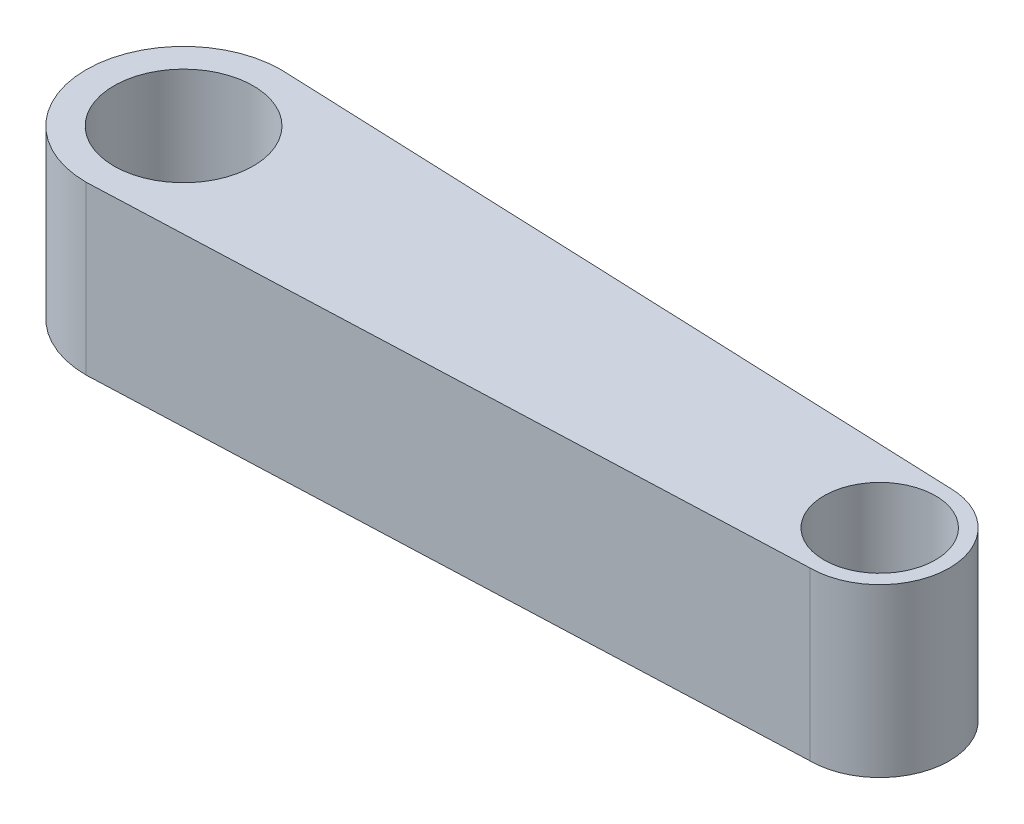
ISO-10303-21;
HEADER;
FILE_DESCRIPTION(('STEP AP214'),'2;1');
FILE_NAME('part.step','',(''),(''),'','','');
FILE_SCHEMA(('AUTOMOTIVE_DESIGN { 1 0 10303 214 1 1 1 1 }'));
ENDSEC;
DATA;
#1=APPLICATION_CONTEXT('core data for automotive mechanical design processes');
#2=APPLICATION_PROTOCOL_DEFINITION('international standard','automotive_design',2000,#1);
#3=PRODUCT_CONTEXT('',#1,'mechanical');
#4=PRODUCT('Part','Part','',(#3));
#5=PRODUCT_RELATED_PRODUCT_CATEGORY('part','',(#4));
#6=PRODUCT_DEFINITION_FORMATION('','',#4);
#7=PRODUCT_DEFINITION_CONTEXT('part definition',#1,'design');
#8=PRODUCT_DEFINITION('design','',#6,#7);
#9=PRODUCT_DEFINITION_SHAPE('','',#8);
#10=(LENGTH_UNIT() NAMED_UNIT(*) SI_UNIT(.MILLI.,.METRE.));
#11=(NAMED_UNIT(*) PLANE_ANGLE_UNIT() SI_UNIT($,.RADIAN.));
#12=(NAMED_UNIT(*) SI_UNIT($,.STERADIAN.) SOLID_ANGLE_UNIT());
#13=UNCERTAINTY_MEASURE_WITH_UNIT(LENGTH_MEASURE(1.E-05),#10,'distance_accuracy_value','');
#14=(GEOMETRIC_REPRESENTATION_CONTEXT(3) GLOBAL_UNCERTAINTY_ASSIGNED_CONTEXT((#13)) GLOBAL_UNIT_ASSIGNED_CONTEXT((#10,
#11,#12)) REPRESENTATION_CONTEXT('',''));
#15=CARTESIAN_POINT('',(0.,0.,0.));
#16=DIRECTION('',(0.,0.,1.));
#17=DIRECTION('',(1.,0.,0.));
#18=AXIS2_PLACEMENT_3D('',#15,#16,#17);
#19=CARTESIAN_POINT('',(0.,60.,0.));
#20=DIRECTION('',(0.,-1.,0.));
#21=DIRECTION('',(0.,0.,-1.));
#22=AXIS2_PLACEMENT_3D('',#19,#20,#21);
#23=CYLINDRICAL_SURFACE('',#22,35.);
#24=CARTESIAN_POINT('',(0.,0.,0.));
#25=DIRECTION('',(0.,1.,0.));
#26=DIRECTION('',(0.,0.,1.));
#27=AXIS2_PLACEMENT_3D('',#24,#25,#26);
#28=CIRCLE('',#27,35.);
#29=CARTESIAN_POINT('',(0.,0.,-35.));
#30=VERTEX_POINT('',#29);
#31=CARTESIAN_POINT('',(0.,0.,35.));
#32=VERTEX_POINT('',#31);
#33=EDGE_CURVE('E95',#30,#32,#28,.T.);
#34=ORIENTED_EDGE('',*,*,#33,.T.);
#35=DIRECTION('',(0.,-1.,0.));
#36=VECTOR('',#35,1.);
#37=CARTESIAN_POINT('',(0.,60.,35.));
#38=LINE('',#37,#36);
#39=CARTESIAN_POINT('',(0.,60.,35.));
#40=VERTEX_POINT('',#39);
#41=EDGE_CURVE('E11',#40,#32,#38,.T.);
#42=ORIENTED_EDGE('',*,*,#41,.F.);
#43=CARTESIAN_POINT('',(0.,60.,0.));
#44=DIRECTION('',(0.,1.,0.));
#45=DIRECTION('',(0.,0.,1.));
#46=AXIS2_PLACEMENT_3D('',#43,#44,#45);
#47=CIRCLE('',#46,35.);
#48=CARTESIAN_POINT('',(0.,60.,-35.));
#49=VERTEX_POINT('',#48);
#50=EDGE_CURVE('E83',#49,#40,#47,.T.);
#51=ORIENTED_EDGE('',*,*,#50,.F.);
#52=DIRECTION('',(0.,-1.,0.));
#53=VECTOR('',#52,1.);
#54=CARTESIAN_POINT('',(0.,60.,-35.));
#55=LINE('',#54,#53);
#56=EDGE_CURVE('E91',#49,#30,#55,.T.);
#57=ORIENTED_EDGE('',*,*,#56,.T.);
#58=EDGE_LOOP('',(#34,#42,#51,#57));
#59=FACE_BOUND('',#58,.T.);
#60=ADVANCED_FACE('F32',(#59),#23,.T.);
#61=CARTESIAN_POINT('',(0.,60.,35.));
#62=DIRECTION('',(-0.0399680383488715,0.,-0.999200958721789));
#63=DIRECTION('',(-0.999200958721789,0.,0.0399680383488715));
#64=AXIS2_PLACEMENT_3D('',#61,#62,#63);
#65=PLANE('',#64);
#66=DIRECTION('',(0.999200958721789,0.,-0.0399680383488715));
#67=VECTOR('',#66,1.);
#68=CARTESIAN_POINT('',(0.,0.,35.));
#69=LINE('',#68,#67);
#70=CARTESIAN_POINT('',(250.,0.,25.));
#71=VERTEX_POINT('',#70);
#72=EDGE_CURVE('E87',#32,#71,#69,.T.);
#73=ORIENTED_EDGE('',*,*,#72,.T.);
#74=DIRECTION('',(0.,-1.,0.));
#75=VECTOR('',#74,1.);
#76=CARTESIAN_POINT('',(250.,60.,25.));
#77=LINE('',#76,#75);
#78=CARTESIAN_POINT('',(250.,60.,25.));
#79=VERTEX_POINT('',#78);
#80=EDGE_CURVE('E40',#79,#71,#77,.T.);
#81=ORIENTED_EDGE('',*,*,#80,.F.);
#82=DIRECTION('',(0.999200958721789,0.,-0.0399680383488715));
#83=VECTOR('',#82,1.);
#84=CARTESIAN_POINT('',(0.,60.,35.));
#85=LINE('',#84,#83);
#86=EDGE_CURVE('E78',#40,#79,#85,.T.);
#87=ORIENTED_EDGE('',*,*,#86,.F.);
#88=ORIENTED_EDGE('',*,*,#41,.T.);
#89=EDGE_LOOP('',(#73,#81,#87,#88));
#90=FACE_BOUND('',#89,.T.);
#91=ADVANCED_FACE('F86',(#90),#65,.F.);
#92=CARTESIAN_POINT('',(250.,60.,0.));
#93=DIRECTION('',(0.,-1.,0.));
#94=DIRECTION('',(0.,0.,-1.));
#95=AXIS2_PLACEMENT_3D('',#92,#93,#94);
#96=CYLINDRICAL_SURFACE('',#95,25.);
#97=CARTESIAN_POINT('',(250.,0.,0.));
#98=DIRECTION('',(0.,1.,0.));
#99=DIRECTION('',(0.,0.,1.));
#100=AXIS2_PLACEMENT_3D('',#97,#98,#99);
#101=CIRCLE('',#100,25.);
#102=CARTESIAN_POINT('',(250.,0.,-25.));
#103=VERTEX_POINT('',#102);
#104=EDGE_CURVE('E65',#71,#103,#101,.T.);
#105=ORIENTED_EDGE('',*,*,#104,.T.);
#106=DIRECTION('',(0.,-1.,0.));
#107=VECTOR('',#106,1.);
#108=CARTESIAN_POINT('',(250.,60.,-25.));
#109=LINE('',#108,#107);
#110=CARTESIAN_POINT('',(250.,60.,-25.));
#111=VERTEX_POINT('',#110);
#112=EDGE_CURVE('E88',#111,#103,#109,.T.);
#113=ORIENTED_EDGE('',*,*,#112,.F.);
#114=CARTESIAN_POINT('',(250.,60.,0.));
#115=DIRECTION('',(0.,1.,0.));
#116=DIRECTION('',(0.,0.,1.));
#117=AXIS2_PLACEMENT_3D('',#114,#115,#116);
#118=CIRCLE('',#117,25.);
#119=EDGE_CURVE('E81',#79,#111,#118,.T.);
#120=ORIENTED_EDGE('',*,*,#119,.F.);
#121=ORIENTED_EDGE('',*,*,#80,.T.);
#122=EDGE_LOOP('',(#105,#113,#120,#121));
#123=FACE_BOUND('',#122,.T.);
#124=ADVANCED_FACE('F89',(#123),#96,.T.);
#125=CARTESIAN_POINT('',(0.,60.,-35.));
#126=DIRECTION('',(-0.0399680383488715,0.,0.999200958721789));
#127=DIRECTION('',(0.999200958721789,0.,0.0399680383488715));
#128=AXIS2_PLACEMENT_3D('',#125,#126,#127);
#129=PLANE('',#128);
#130=DIRECTION('',(-0.999200958721789,0.,-0.0399680383488715));
#131=VECTOR('',#130,1.);
#132=CARTESIAN_POINT('',(0.,0.,-35.));
#133=LINE('',#132,#131);
#134=EDGE_CURVE('E71',#103,#30,#133,.T.);
#135=ORIENTED_EDGE('',*,*,#134,.T.);
#136=ORIENTED_EDGE('',*,*,#56,.F.);
#137=DIRECTION('',(-0.999200958721789,0.,-0.0399680383488715));
#138=VECTOR('',#137,1.);
#139=CARTESIAN_POINT('',(0.,60.,-35.));
#140=LINE('',#139,#138);
#141=EDGE_CURVE('E48',#111,#49,#140,.T.);
#142=ORIENTED_EDGE('',*,*,#141,.F.);
#143=ORIENTED_EDGE('',*,*,#112,.T.);
#144=EDGE_LOOP('',(#135,#136,#142,#143));
#145=FACE_BOUND('',#144,.T.);
#146=ADVANCED_FACE('F103',(#145),#129,.F.);
#147=CARTESIAN_POINT('',(0.,60.,0.));
#148=DIRECTION('',(0.,1.,0.));
#149=DIRECTION('',(0.,0.,1.));
#150=AXIS2_PLACEMENT_3D('',#147,#148,#149);
#151=PLANE('',#150);
#152=CARTESIAN_POINT('',(250.,60.,0.));
#153=DIRECTION('',(0.,1.,0.));
#154=DIRECTION('',(0.,0.,1.));
#155=AXIS2_PLACEMENT_3D('',#152,#153,#154);
#156=CIRCLE('',#155,20.);
#157=CARTESIAN_POINT('',(250.,60.,20.));
#158=VERTEX_POINT('',#157);
#159=EDGE_CURVE('E115',#158,#158,#156,.T.);
#160=ORIENTED_EDGE('',*,*,#159,.F.);
#161=EDGE_LOOP('',(#160));
#162=FACE_BOUND('',#161,.T.);
#163=CARTESIAN_POINT('',(0.,60.,0.));
#164=DIRECTION('',(0.,1.,0.));
#165=DIRECTION('',(0.,0.,1.));
#166=AXIS2_PLACEMENT_3D('',#163,#164,#165);
#167=CIRCLE('',#166,25.);
#168=CARTESIAN_POINT('',(0.,60.,25.));
#169=VERTEX_POINT('',#168);
#170=EDGE_CURVE('E109',#169,#169,#167,.T.);
#171=ORIENTED_EDGE('',*,*,#170,.F.);
#172=EDGE_LOOP('',(#171));
#173=FACE_BOUND('',#172,.T.);
#174=ORIENTED_EDGE('',*,*,#50,.T.);
#175=ORIENTED_EDGE('',*,*,#86,.T.);
#176=ORIENTED_EDGE('',*,*,#119,.T.);
#177=ORIENTED_EDGE('',*,*,#141,.T.);
#178=EDGE_LOOP('',(#174,#175,#176,#177));
#179=FACE_BOUND('',#178,.T.);
#180=ADVANCED_FACE('F79',(#162,#173,#179),#151,.T.);
#181=CARTESIAN_POINT('',(0.,0.,0.));
#182=DIRECTION('',(0.,1.,0.));
#183=DIRECTION('',(0.,0.,1.));
#184=AXIS2_PLACEMENT_3D('',#181,#182,#183);
#185=PLANE('',#184);
#186=ORIENTED_EDGE('',*,*,#33,.F.);
#187=ORIENTED_EDGE('',*,*,#134,.F.);
#188=ORIENTED_EDGE('',*,*,#104,.F.);
#189=ORIENTED_EDGE('',*,*,#72,.F.);
#190=EDGE_LOOP('',(#186,#187,#188,#189));
#191=FACE_BOUND('',#190,.T.);
#192=ADVANCED_FACE('F106',(#191),#185,.F.);
#193=CARTESIAN_POINT('',(0.,9.99999999999999,0.));
#194=DIRECTION('',(0.,1.,0.));
#195=DIRECTION('',(0.,0.,1.));
#196=AXIS2_PLACEMENT_3D('',#193,#194,#195);
#197=CYLINDRICAL_SURFACE('',#196,25.);
#198=CARTESIAN_POINT('',(0.,9.99999999999999,0.));
#199=DIRECTION('',(0.,1.,0.));
#200=DIRECTION('',(0.,0.,1.));
#201=AXIS2_PLACEMENT_3D('',#198,#199,#200);
#202=CIRCLE('',#201,25.);
#203=CARTESIAN_POINT('',(0.,9.99999999999999,25.));
#204=VERTEX_POINT('',#203);
#205=EDGE_CURVE('E98',#204,#204,#202,.T.);
#206=ORIENTED_EDGE('',*,*,#205,.F.);
#207=EDGE_LOOP('',(#206));
#208=FACE_BOUND('',#207,.T.);
#209=ORIENTED_EDGE('',*,*,#170,.T.);
#210=EDGE_LOOP('',(#209));
#211=FACE_BOUND('',#210,.T.);
#212=ADVANCED_FACE('F135',(#208,#211),#197,.F.);
#213=CARTESIAN_POINT('',(0.,9.99999999999999,0.));
#214=DIRECTION('',(0.,1.,0.));
#215=DIRECTION('',(0.,0.,1.));
#216=AXIS2_PLACEMENT_3D('',#213,#214,#215);
#217=PLANE('',#216);
#218=ORIENTED_EDGE('',*,*,#205,.T.);
#219=EDGE_LOOP('',(#218));
#220=FACE_BOUND('',#219,.T.);
#221=ADVANCED_FACE('F126',(#220),#217,.T.);
#222=CARTESIAN_POINT('',(250.,9.99999999999999,0.));
#223=DIRECTION('',(0.,1.,0.));
#224=DIRECTION('',(0.,0.,1.));
#225=AXIS2_PLACEMENT_3D('',#222,#223,#224);
#226=CYLINDRICAL_SURFACE('',#225,20.);
#227=CARTESIAN_POINT('',(250.,9.99999999999999,0.));
#228=DIRECTION('',(0.,1.,0.));
#229=DIRECTION('',(0.,0.,1.));
#230=AXIS2_PLACEMENT_3D('',#227,#228,#229);
#231=CIRCLE('',#230,20.);
#232=CARTESIAN_POINT('',(250.,9.99999999999999,20.));
#233=VERTEX_POINT('',#232);
#234=EDGE_CURVE('E112',#233,#233,#231,.T.);
#235=ORIENTED_EDGE('',*,*,#234,.F.);
#236=EDGE_LOOP('',(#235));
#237=FACE_BOUND('',#236,.T.);
#238=ORIENTED_EDGE('',*,*,#159,.T.);
#239=EDGE_LOOP('',(#238));
#240=FACE_BOUND('',#239,.T.);
#241=ADVANCED_FACE('F123',(#237,#240),#226,.F.);
#242=CARTESIAN_POINT('',(250.,9.99999999999999,0.));
#243=DIRECTION('',(0.,1.,0.));
#244=DIRECTION('',(0.,0.,1.));
#245=AXIS2_PLACEMENT_3D('',#242,#243,#244);
#246=PLANE('',#245);
#247=ORIENTED_EDGE('',*,*,#234,.T.);
#248=EDGE_LOOP('',(#247));
#249=FACE_BOUND('',#248,.T.);
#250=ADVANCED_FACE('F121',(#249),#246,.T.);
#251=CLOSED_SHELL('',(#60,#91,#124,#146,#180,#192,#212,#221,#241,#250));
#252=MANIFOLD_SOLID_BREP('B2',#251);
#253=ADVANCED_BREP_SHAPE_REPRESENTATION('',(#18,#252),#14);
#254=SHAPE_DEFINITION_REPRESENTATION(#9,#253);
ENDSEC;
END-ISO-10303-21;
